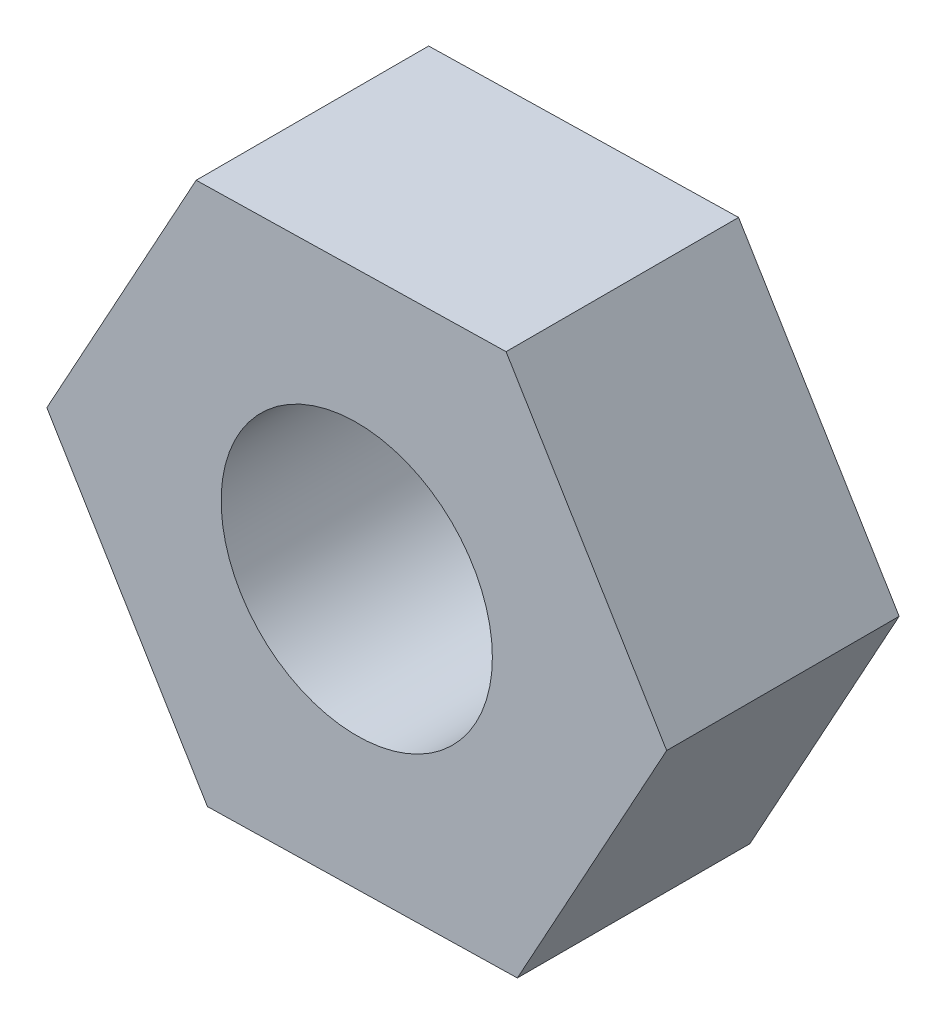
ISO-10303-21;
HEADER;
FILE_DESCRIPTION(('STEP AP214'),'2;1');
FILE_NAME('part.step','',(''),(''),'','','');
FILE_SCHEMA(('AUTOMOTIVE_DESIGN { 1 0 10303 214 1 1 1 1 }'));
ENDSEC;
DATA;
#1=APPLICATION_CONTEXT('core data for automotive mechanical design processes');
#2=APPLICATION_PROTOCOL_DEFINITION('international standard','automotive_design',2000,#1);
#3=PRODUCT_CONTEXT('',#1,'mechanical');
#4=PRODUCT('Part','Part','',(#3));
#5=PRODUCT_RELATED_PRODUCT_CATEGORY('part','',(#4));
#6=PRODUCT_DEFINITION_FORMATION('','',#4);
#7=PRODUCT_DEFINITION_CONTEXT('part definition',#1,'design');
#8=PRODUCT_DEFINITION('design','',#6,#7);
#9=PRODUCT_DEFINITION_SHAPE('','',#8);
#10=(LENGTH_UNIT() NAMED_UNIT(*) SI_UNIT(.MILLI.,.METRE.));
#11=(NAMED_UNIT(*) PLANE_ANGLE_UNIT() SI_UNIT($,.RADIAN.));
#12=(NAMED_UNIT(*) SI_UNIT($,.STERADIAN.) SOLID_ANGLE_UNIT());
#13=UNCERTAINTY_MEASURE_WITH_UNIT(LENGTH_MEASURE(1.E-05),#10,'distance_accuracy_value','');
#14=(GEOMETRIC_REPRESENTATION_CONTEXT(3) GLOBAL_UNCERTAINTY_ASSIGNED_CONTEXT((#13)) GLOBAL_UNIT_ASSIGNED_CONTEXT((#10,
#11,#12)) REPRESENTATION_CONTEXT('',''));
#15=CARTESIAN_POINT('',(0.,0.,0.));
#16=DIRECTION('',(0.,0.,1.));
#17=DIRECTION('',(1.,0.,0.));
#18=AXIS2_PLACEMENT_3D('',#15,#16,#17);
#19=CARTESIAN_POINT('',(0.,0.,3.));
#20=DIRECTION('',(0.,0.,1.));
#21=DIRECTION('',(1.,0.,0.));
#22=AXIS2_PLACEMENT_3D('',#19,#20,#21);
#23=PLANE('',#22);
#24=DIRECTION('',(-0.518057914141695,0.855345542804285,0.));
#25=VECTOR('',#24,1.);
#26=CARTESIAN_POINT('',(3.99911970461259,0.0839141715045736,3.));
#27=LINE('',#26,#25);
#28=CARTESIAN_POINT('',(3.99911970461259,0.0839141715045736,3.));
#29=VERTEX_POINT('',#28);
#30=CARTESIAN_POINT('',(1.92688804804581,3.50529634272171,3.));
#31=VERTEX_POINT('',#30);
#32=EDGE_CURVE('E146',#29,#31,#27,.T.);
#33=ORIENTED_EDGE('',*,*,#32,.T.);
#34=DIRECTION('',(-0.999779926153148,-0.0209785428761431,0.));
#35=VECTOR('',#34,1.);
#36=CARTESIAN_POINT('',(1.92688804804581,3.50529634272171,3.));
#37=LINE('',#36,#35);
#38=CARTESIAN_POINT('',(-2.07223165656678,3.42138217121714,3.));
#39=VERTEX_POINT('',#38);
#40=EDGE_CURVE('E94',#31,#39,#37,.T.);
#41=ORIENTED_EDGE('',*,*,#40,.T.);
#42=DIRECTION('',(-0.481722012011452,-0.876324085680428,0.));
#43=VECTOR('',#42,1.);
#44=CARTESIAN_POINT('',(-2.07223165656678,3.42138217121714,3.));
#45=LINE('',#44,#43);
#46=CARTESIAN_POINT('',(-3.99911970461259,-0.0839141715045751,3.));
#47=VERTEX_POINT('',#46);
#48=EDGE_CURVE('E107',#39,#47,#45,.T.);
#49=ORIENTED_EDGE('',*,*,#48,.T.);
#50=DIRECTION('',(0.518057914141695,-0.855345542804285,0.));
#51=VECTOR('',#50,1.);
#52=CARTESIAN_POINT('',(-3.99911970461259,-0.0839141715045751,3.));
#53=LINE('',#52,#51);
#54=CARTESIAN_POINT('',(-1.92688804804581,-3.50529634272171,3.));
#55=VERTEX_POINT('',#54);
#56=EDGE_CURVE('E101',#47,#55,#53,.T.);
#57=ORIENTED_EDGE('',*,*,#56,.T.);
#58=DIRECTION('',(0.999779926153148,0.0209785428761432,0.));
#59=VECTOR('',#58,1.);
#60=CARTESIAN_POINT('',(-1.92688804804581,-3.50529634272171,3.));
#61=LINE('',#60,#59);
#62=CARTESIAN_POINT('',(2.07223165656678,-3.42138217121714,3.));
#63=VERTEX_POINT('',#62);
#64=EDGE_CURVE('E105',#55,#63,#61,.T.);
#65=ORIENTED_EDGE('',*,*,#64,.T.);
#66=DIRECTION('',(0.481722012011453,0.876324085680428,0.));
#67=VECTOR('',#66,1.);
#68=CARTESIAN_POINT('',(2.07223165656678,-3.42138217121714,3.));
#69=LINE('',#68,#67);
#70=EDGE_CURVE('E57',#63,#29,#69,.T.);
#71=ORIENTED_EDGE('',*,*,#70,.T.);
#72=EDGE_LOOP('',(#33,#41,#49,#57,#65,#71));
#73=FACE_BOUND('',#72,.T.);
#74=CARTESIAN_POINT('',(0.,0.,3.));
#75=DIRECTION('',(0.,0.,1.));
#76=DIRECTION('',(1.,0.,0.));
#77=AXIS2_PLACEMENT_3D('',#74,#75,#76);
#78=CIRCLE('',#77,1.75);
#79=CARTESIAN_POINT('',(1.75,0.,3.));
#80=VERTEX_POINT('',#79);
#81=EDGE_CURVE('E134',#80,#80,#78,.T.);
#82=ORIENTED_EDGE('',*,*,#81,.F.);
#83=EDGE_LOOP('',(#82));
#84=FACE_BOUND('',#83,.T.);
#85=ADVANCED_FACE('F39',(#73,#84),#23,.T.);
#86=CARTESIAN_POINT('',(0.,0.,0.));
#87=DIRECTION('',(0.,0.,1.));
#88=DIRECTION('',(1.,0.,0.));
#89=AXIS2_PLACEMENT_3D('',#86,#87,#88);
#90=PLANE('',#89);
#91=DIRECTION('',(-0.518057914141695,0.855345542804285,0.));
#92=VECTOR('',#91,1.);
#93=CARTESIAN_POINT('',(3.99911970461259,0.0839141715045736,0.));
#94=LINE('',#93,#92);
#95=CARTESIAN_POINT('',(3.99911970461259,0.0839141715045736,0.));
#96=VERTEX_POINT('',#95);
#97=CARTESIAN_POINT('',(1.92688804804581,3.50529634272171,0.));
#98=VERTEX_POINT('',#97);
#99=EDGE_CURVE('E129',#96,#98,#94,.T.);
#100=ORIENTED_EDGE('',*,*,#99,.F.);
#101=DIRECTION('',(0.481722012011453,0.876324085680428,0.));
#102=VECTOR('',#101,1.);
#103=CARTESIAN_POINT('',(2.07223165656678,-3.42138217121714,0.));
#104=LINE('',#103,#102);
#105=CARTESIAN_POINT('',(2.07223165656678,-3.42138217121714,0.));
#106=VERTEX_POINT('',#105);
#107=EDGE_CURVE('E86',#106,#96,#104,.T.);
#108=ORIENTED_EDGE('',*,*,#107,.F.);
#109=DIRECTION('',(0.999779926153148,0.0209785428761432,0.));
#110=VECTOR('',#109,1.);
#111=CARTESIAN_POINT('',(-1.92688804804581,-3.50529634272171,0.));
#112=LINE('',#111,#110);
#113=CARTESIAN_POINT('',(-1.92688804804581,-3.50529634272171,0.));
#114=VERTEX_POINT('',#113);
#115=EDGE_CURVE('E80',#114,#106,#112,.T.);
#116=ORIENTED_EDGE('',*,*,#115,.F.);
#117=DIRECTION('',(0.518057914141695,-0.855345542804285,0.));
#118=VECTOR('',#117,1.);
#119=CARTESIAN_POINT('',(-3.99911970461259,-0.0839141715045751,0.));
#120=LINE('',#119,#118);
#121=CARTESIAN_POINT('',(-3.99911970461259,-0.0839141715045751,0.));
#122=VERTEX_POINT('',#121);
#123=EDGE_CURVE('E116',#122,#114,#120,.T.);
#124=ORIENTED_EDGE('',*,*,#123,.F.);
#125=DIRECTION('',(-0.481722012011452,-0.876324085680428,0.));
#126=VECTOR('',#125,1.);
#127=CARTESIAN_POINT('',(-2.07223165656678,3.42138217121714,0.));
#128=LINE('',#127,#126);
#129=CARTESIAN_POINT('',(-2.07223165656678,3.42138217121714,0.));
#130=VERTEX_POINT('',#129);
#131=EDGE_CURVE('E137',#130,#122,#128,.T.);
#132=ORIENTED_EDGE('',*,*,#131,.F.);
#133=DIRECTION('',(-0.999779926153148,-0.0209785428761431,0.));
#134=VECTOR('',#133,1.);
#135=CARTESIAN_POINT('',(1.92688804804581,3.50529634272171,0.));
#136=LINE('',#135,#134);
#137=EDGE_CURVE('E133',#98,#130,#136,.T.);
#138=ORIENTED_EDGE('',*,*,#137,.F.);
#139=EDGE_LOOP('',(#100,#108,#116,#124,#132,#138));
#140=FACE_BOUND('',#139,.T.);
#141=CARTESIAN_POINT('',(0.,0.,0.));
#142=DIRECTION('',(0.,0.,1.));
#143=DIRECTION('',(1.,0.,0.));
#144=AXIS2_PLACEMENT_3D('',#141,#142,#143);
#145=CIRCLE('',#144,1.75);
#146=CARTESIAN_POINT('',(1.75,0.,0.));
#147=VERTEX_POINT('',#146);
#148=EDGE_CURVE('E243',#147,#147,#145,.T.);
#149=ORIENTED_EDGE('',*,*,#148,.T.);
#150=EDGE_LOOP('',(#149));
#151=FACE_BOUND('',#150,.T.);
#152=ADVANCED_FACE('F159',(#140,#151),#90,.F.);
#153=CARTESIAN_POINT('',(3.99911970461259,0.0839141715045736,3.));
#154=DIRECTION('',(-0.855345542804285,-0.518057914141695,0.));
#155=DIRECTION('',(0.518057914141695,-0.855345542804285,0.));
#156=AXIS2_PLACEMENT_3D('',#153,#154,#155);
#157=PLANE('',#156);
#158=ORIENTED_EDGE('',*,*,#99,.T.);
#159=DIRECTION('',(0.,0.,-1.));
#160=VECTOR('',#159,1.);
#161=CARTESIAN_POINT('',(1.92688804804581,3.50529634272171,3.));
#162=LINE('',#161,#160);
#163=EDGE_CURVE('E11',#31,#98,#162,.T.);
#164=ORIENTED_EDGE('',*,*,#163,.F.);
#165=ORIENTED_EDGE('',*,*,#32,.F.);
#166=DIRECTION('',(0.,0.,-1.));
#167=VECTOR('',#166,1.);
#168=CARTESIAN_POINT('',(3.99911970461259,0.0839141715045736,3.));
#169=LINE('',#168,#167);
#170=EDGE_CURVE('E125',#29,#96,#169,.T.);
#171=ORIENTED_EDGE('',*,*,#170,.T.);
#172=EDGE_LOOP('',(#158,#164,#165,#171));
#173=FACE_BOUND('',#172,.T.);
#174=ADVANCED_FACE('F41',(#173),#157,.F.);
#175=CARTESIAN_POINT('',(1.92688804804581,3.50529634272171,3.));
#176=DIRECTION('',(0.0209785428761431,-0.999779926153148,0.));
#177=DIRECTION('',(0.999779926153148,0.0209785428761431,0.));
#178=AXIS2_PLACEMENT_3D('',#175,#176,#177);
#179=PLANE('',#178);
#180=ORIENTED_EDGE('',*,*,#137,.T.);
#181=DIRECTION('',(0.,0.,-1.));
#182=VECTOR('',#181,1.);
#183=CARTESIAN_POINT('',(-2.07223165656678,3.42138217121714,3.));
#184=LINE('',#183,#182);
#185=EDGE_CURVE('E49',#39,#130,#184,.T.);
#186=ORIENTED_EDGE('',*,*,#185,.F.);
#187=ORIENTED_EDGE('',*,*,#40,.F.);
#188=ORIENTED_EDGE('',*,*,#163,.T.);
#189=EDGE_LOOP('',(#180,#186,#187,#188));
#190=FACE_BOUND('',#189,.T.);
#191=ADVANCED_FACE('F184',(#190),#179,.F.);
#192=CARTESIAN_POINT('',(-2.07223165656678,3.42138217121714,3.));
#193=DIRECTION('',(0.876324085680428,-0.481722012011452,0.));
#194=DIRECTION('',(0.481722012011452,0.876324085680428,0.));
#195=AXIS2_PLACEMENT_3D('',#192,#193,#194);
#196=PLANE('',#195);
#197=ORIENTED_EDGE('',*,*,#131,.T.);
#198=DIRECTION('',(0.,0.,-1.));
#199=VECTOR('',#198,1.);
#200=CARTESIAN_POINT('',(-3.99911970461259,-0.0839141715045751,3.));
#201=LINE('',#200,#199);
#202=EDGE_CURVE('E118',#47,#122,#201,.T.);
#203=ORIENTED_EDGE('',*,*,#202,.F.);
#204=ORIENTED_EDGE('',*,*,#48,.F.);
#205=ORIENTED_EDGE('',*,*,#185,.T.);
#206=EDGE_LOOP('',(#197,#203,#204,#205));
#207=FACE_BOUND('',#206,.T.);
#208=ADVANCED_FACE('F156',(#207),#196,.F.);
#209=CARTESIAN_POINT('',(-3.99911970461259,-0.0839141715045751,3.));
#210=DIRECTION('',(0.855345542804284,0.518057914141695,0.));
#211=DIRECTION('',(-0.518057914141695,0.855345542804285,0.));
#212=AXIS2_PLACEMENT_3D('',#209,#210,#211);
#213=PLANE('',#212);
#214=ORIENTED_EDGE('',*,*,#123,.T.);
#215=DIRECTION('',(0.,0.,-1.));
#216=VECTOR('',#215,1.);
#217=CARTESIAN_POINT('',(-1.92688804804581,-3.50529634272171,3.));
#218=LINE('',#217,#216);
#219=EDGE_CURVE('E113',#55,#114,#218,.T.);
#220=ORIENTED_EDGE('',*,*,#219,.F.);
#221=ORIENTED_EDGE('',*,*,#56,.F.);
#222=ORIENTED_EDGE('',*,*,#202,.T.);
#223=EDGE_LOOP('',(#214,#220,#221,#222));
#224=FACE_BOUND('',#223,.T.);
#225=ADVANCED_FACE('F114',(#224),#213,.F.);
#226=CARTESIAN_POINT('',(-1.92688804804581,-3.50529634272171,3.));
#227=DIRECTION('',(-0.0209785428761432,0.999779926153148,0.));
#228=DIRECTION('',(-0.999779926153148,-0.0209785428761432,0.));
#229=AXIS2_PLACEMENT_3D('',#226,#227,#228);
#230=PLANE('',#229);
#231=ORIENTED_EDGE('',*,*,#115,.T.);
#232=DIRECTION('',(0.,0.,-1.));
#233=VECTOR('',#232,1.);
#234=CARTESIAN_POINT('',(2.07223165656678,-3.42138217121714,3.));
#235=LINE('',#234,#233);
#236=EDGE_CURVE('E119',#63,#106,#235,.T.);
#237=ORIENTED_EDGE('',*,*,#236,.F.);
#238=ORIENTED_EDGE('',*,*,#64,.F.);
#239=ORIENTED_EDGE('',*,*,#219,.T.);
#240=EDGE_LOOP('',(#231,#237,#238,#239));
#241=FACE_BOUND('',#240,.T.);
#242=ADVANCED_FACE('F121',(#241),#230,.F.);
#243=CARTESIAN_POINT('',(2.07223165656678,-3.42138217121714,3.));
#244=DIRECTION('',(-0.876324085680428,0.481722012011453,0.));
#245=DIRECTION('',(-0.481722012011453,-0.876324085680428,0.));
#246=AXIS2_PLACEMENT_3D('',#243,#244,#245);
#247=PLANE('',#246);
#248=ORIENTED_EDGE('',*,*,#107,.T.);
#249=ORIENTED_EDGE('',*,*,#170,.F.);
#250=ORIENTED_EDGE('',*,*,#70,.F.);
#251=ORIENTED_EDGE('',*,*,#236,.T.);
#252=EDGE_LOOP('',(#248,#249,#250,#251));
#253=FACE_BOUND('',#252,.T.);
#254=ADVANCED_FACE('F164',(#253),#247,.F.);
#255=CARTESIAN_POINT('',(0.,0.,3.));
#256=DIRECTION('',(0.,0.,-1.));
#257=DIRECTION('',(-1.,0.,0.));
#258=AXIS2_PLACEMENT_3D('',#255,#256,#257);
#259=CYLINDRICAL_SURFACE('',#258,1.75);
#260=ORIENTED_EDGE('',*,*,#81,.T.);
#261=EDGE_LOOP('',(#260));
#262=FACE_BOUND('',#261,.T.);
#263=ORIENTED_EDGE('',*,*,#148,.F.);
#264=EDGE_LOOP('',(#263));
#265=FACE_BOUND('',#264,.T.);
#266=ADVANCED_FACE('F166',(#262,#265),#259,.F.);
#267=CLOSED_SHELL('',(#85,#152,#174,#191,#208,#225,#242,#254,#266));
#268=MANIFOLD_SOLID_BREP('B2',#267);
#269=ADVANCED_BREP_SHAPE_REPRESENTATION('',(#18,#268),#14);
#270=SHAPE_DEFINITION_REPRESENTATION(#9,#269);
ENDSEC;
END-ISO-10303-21;
